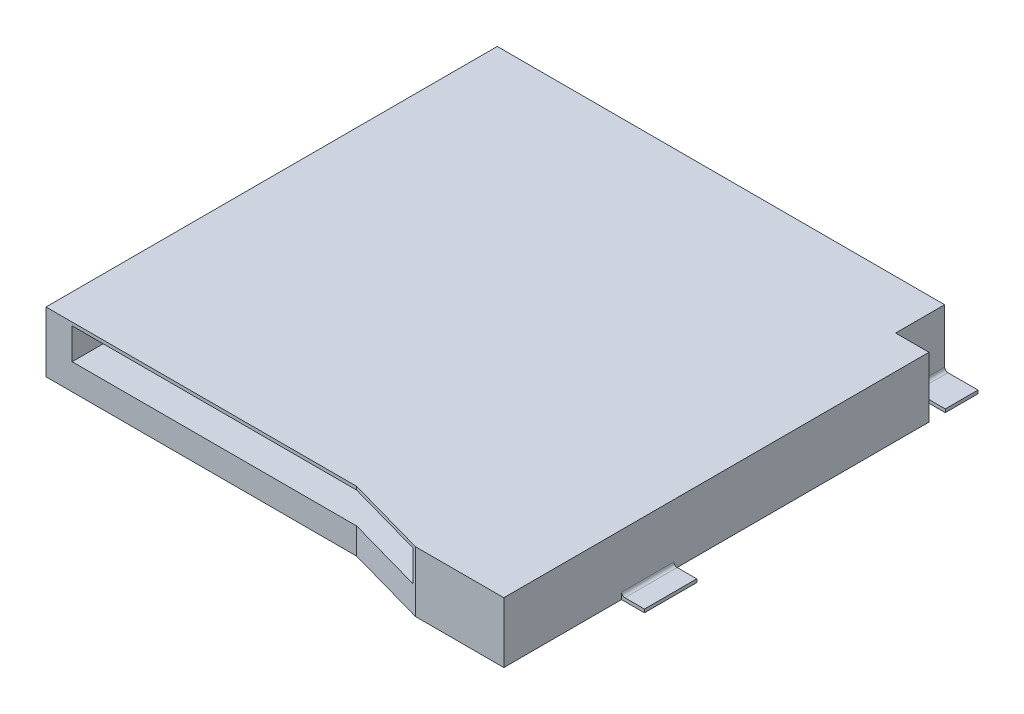
ISO-10303-21;
HEADER;
FILE_DESCRIPTION(('STEP AP214'),'2;1');
FILE_NAME('part.step','',(''),(''),'','','');
FILE_SCHEMA(('AUTOMOTIVE_DESIGN { 1 0 10303 214 1 1 1 1 }'));
ENDSEC;
DATA;
#1=APPLICATION_CONTEXT('core data for automotive mechanical design processes');
#2=APPLICATION_PROTOCOL_DEFINITION('international standard','automotive_design',2000,#1);
#3=PRODUCT_CONTEXT('',#1,'mechanical');
#4=PRODUCT('Part','Part','',(#3));
#5=PRODUCT_RELATED_PRODUCT_CATEGORY('part','',(#4));
#6=PRODUCT_DEFINITION_FORMATION('','',#4);
#7=PRODUCT_DEFINITION_CONTEXT('part definition',#1,'design');
#8=PRODUCT_DEFINITION('design','',#6,#7);
#9=PRODUCT_DEFINITION_SHAPE('','',#8);
#10=(LENGTH_UNIT() NAMED_UNIT(*) SI_UNIT(.MILLI.,.METRE.));
#11=(NAMED_UNIT(*) PLANE_ANGLE_UNIT() SI_UNIT($,.RADIAN.));
#12=(NAMED_UNIT(*) SI_UNIT($,.STERADIAN.) SOLID_ANGLE_UNIT());
#13=UNCERTAINTY_MEASURE_WITH_UNIT(LENGTH_MEASURE(1.E-05),#10,'distance_accuracy_value','');
#14=(GEOMETRIC_REPRESENTATION_CONTEXT(3) GLOBAL_UNCERTAINTY_ASSIGNED_CONTEXT((#13)) GLOBAL_UNIT_ASSIGNED_CONTEXT((#10,
#11,#12)) REPRESENTATION_CONTEXT('',''));
#15=CARTESIAN_POINT('',(0.,0.,0.));
#16=DIRECTION('',(0.,0.,1.));
#17=DIRECTION('',(1.,0.,0.));
#18=AXIS2_PLACEMENT_3D('',#15,#16,#17);
#19=CARTESIAN_POINT('',(0.,0.,0.));
#20=DIRECTION('',(0.,1.,0.));
#21=DIRECTION('',(0.,0.,1.));
#22=AXIS2_PLACEMENT_3D('',#19,#20,#21);
#23=PLANE('',#22);
#24=CARTESIAN_POINT('',(-4.95,0.,2.85));
#25=DIRECTION('',(0.,1.,0.));
#26=DIRECTION('',(0.,0.,1.));
#27=AXIS2_PLACEMENT_3D('',#24,#25,#26);
#28=CIRCLE('',#27,0.4);
#29=CARTESIAN_POINT('',(-4.95,0.,3.25));
#30=VERTEX_POINT('',#29);
#31=EDGE_CURVE('E426',#30,#30,#28,.F.);
#32=ORIENTED_EDGE('',*,*,#31,.F.);
#33=EDGE_LOOP('',(#32));
#34=FACE_BOUND('',#33,.T.);
#35=DIRECTION('',(0.,0.,1.));
#36=VECTOR('',#35,1.);
#37=CARTESIAN_POINT('',(-6.84,0.,-7.65));
#38=LINE('',#37,#36);
#39=CARTESIAN_POINT('',(-6.84,0.,-6.65));
#40=VERTEX_POINT('',#39);
#41=CARTESIAN_POINT('',(-6.84,0.,1.65));
#42=VERTEX_POINT('',#41);
#43=EDGE_CURVE('E368',#40,#42,#38,.T.);
#44=ORIENTED_EDGE('',*,*,#43,.F.);
#45=DIRECTION('',(1.,0.,0.));
#46=VECTOR('',#45,1.);
#47=CARTESIAN_POINT('',(-6.84,0.,-6.65));
#48=LINE('',#47,#46);
#49=CARTESIAN_POINT('',(-7.54,0.,-6.65));
#50=VERTEX_POINT('',#49);
#51=EDGE_CURVE('E311',#50,#40,#48,.T.);
#52=ORIENTED_EDGE('',*,*,#51,.F.);
#53=DIRECTION('',(0.,0.,1.));
#54=VECTOR('',#53,1.);
#55=CARTESIAN_POINT('',(-7.54,0.,-7.65));
#56=LINE('',#55,#54);
#57=CARTESIAN_POINT('',(-7.54,0.,-7.65));
#58=VERTEX_POINT('',#57);
#59=EDGE_CURVE('E302',#58,#50,#56,.T.);
#60=ORIENTED_EDGE('',*,*,#59,.F.);
#61=DIRECTION('',(-1.,0.,0.));
#62=VECTOR('',#61,1.);
#63=CARTESIAN_POINT('',(-6.84,0.,-7.65));
#64=LINE('',#63,#62);
#65=CARTESIAN_POINT('',(7.86,0.,-7.65));
#66=VERTEX_POINT('',#65);
#67=EDGE_CURVE('E447',#66,#58,#64,.T.);
#68=ORIENTED_EDGE('',*,*,#67,.F.);
#69=DIRECTION('',(0.,0.,-1.));
#70=VECTOR('',#69,1.);
#71=CARTESIAN_POINT('',(7.86,0.,-7.65));
#72=LINE('',#71,#70);
#73=CARTESIAN_POINT('',(7.86,0.,-6.65));
#74=VERTEX_POINT('',#73);
#75=EDGE_CURVE('E468',#74,#66,#72,.T.);
#76=ORIENTED_EDGE('',*,*,#75,.F.);
#77=DIRECTION('',(1.,0.,0.));
#78=VECTOR('',#77,1.);
#79=CARTESIAN_POINT('',(6.84,0.,-6.65));
#80=LINE('',#79,#78);
#81=CARTESIAN_POINT('',(6.84,0.,-6.65));
#82=VERTEX_POINT('',#81);
#83=EDGE_CURVE('E465',#82,#74,#80,.T.);
#84=ORIENTED_EDGE('',*,*,#83,.F.);
#85=DIRECTION('',(0.,0.,-1.));
#86=VECTOR('',#85,1.);
#87=CARTESIAN_POINT('',(6.84,0.,-7.65));
#88=LINE('',#87,#86);
#89=CARTESIAN_POINT('',(6.84,0.,-6.15));
#90=VERTEX_POINT('',#89);
#91=EDGE_CURVE('E449',#90,#82,#88,.T.);
#92=ORIENTED_EDGE('',*,*,#91,.F.);
#93=DIRECTION('',(-1.,0.,0.));
#94=VECTOR('',#93,1.);
#95=CARTESIAN_POINT('',(6.84,0.,-6.15));
#96=LINE('',#95,#94);
#97=CARTESIAN_POINT('',(7.86,0.,-6.15));
#98=VERTEX_POINT('',#97);
#99=EDGE_CURVE('E416',#98,#90,#96,.T.);
#100=ORIENTED_EDGE('',*,*,#99,.F.);
#101=DIRECTION('',(0.,0.,-1.));
#102=VECTOR('',#101,1.);
#103=CARTESIAN_POINT('',(7.86,0.,-6.15));
#104=LINE('',#103,#102);
#105=CARTESIAN_POINT('',(7.86,0.,1.65));
#106=VERTEX_POINT('',#105);
#107=EDGE_CURVE('E413',#106,#98,#104,.T.);
#108=ORIENTED_EDGE('',*,*,#107,.F.);
#109=DIRECTION('',(-1.,0.,0.));
#110=VECTOR('',#109,1.);
#111=CARTESIAN_POINT('',(7.86,0.,1.65));
#112=LINE('',#111,#110);
#113=CARTESIAN_POINT('',(8.56,0.,1.65));
#114=VERTEX_POINT('',#113);
#115=EDGE_CURVE('E489',#114,#106,#112,.T.);
#116=ORIENTED_EDGE('',*,*,#115,.F.);
#117=DIRECTION('',(0.,0.,-1.));
#118=VECTOR('',#117,1.);
#119=CARTESIAN_POINT('',(8.56,0.,1.65));
#120=LINE('',#119,#118);
#121=CARTESIAN_POINT('',(8.56,0.,3.25));
#122=VERTEX_POINT('',#121);
#123=EDGE_CURVE('E481',#122,#114,#120,.T.);
#124=ORIENTED_EDGE('',*,*,#123,.F.);
#125=DIRECTION('',(1.,0.,0.));
#126=VECTOR('',#125,1.);
#127=CARTESIAN_POINT('',(7.86,0.,3.25));
#128=LINE('',#127,#126);
#129=CARTESIAN_POINT('',(7.86,0.,3.25));
#130=VERTEX_POINT('',#129);
#131=EDGE_CURVE('E478',#130,#122,#128,.T.);
#132=ORIENTED_EDGE('',*,*,#131,.F.);
#133=CARTESIAN_POINT('',(7.86,0.,6.85));
#134=VERTEX_POINT('',#133);
#135=EDGE_CURVE('E422',#134,#130,#104,.T.);
#136=ORIENTED_EDGE('',*,*,#135,.F.);
#137=DIRECTION('',(1.,0.,0.));
#138=VECTOR('',#137,1.);
#139=CARTESIAN_POINT('',(5.16,0.,6.85));
#140=LINE('',#139,#138);
#141=CARTESIAN_POINT('',(5.16,0.,6.85));
#142=VERTEX_POINT('',#141);
#143=EDGE_CURVE('E411',#142,#134,#140,.T.);
#144=ORIENTED_EDGE('',*,*,#143,.F.);
#145=DIRECTION('',(0.962964019714182,0.,0.269629925519971));
#146=VECTOR('',#145,1.);
#147=CARTESIAN_POINT('',(2.66,0.,6.15));
#148=LINE('',#147,#146);
#149=CARTESIAN_POINT('',(2.66,0.,6.15));
#150=VERTEX_POINT('',#149);
#151=EDGE_CURVE('E409',#150,#142,#148,.T.);
#152=ORIENTED_EDGE('',*,*,#151,.F.);
#153=DIRECTION('',(1.,0.,0.));
#154=VECTOR('',#153,1.);
#155=CARTESIAN_POINT('',(-6.84,0.,6.15));
#156=LINE('',#155,#154);
#157=CARTESIAN_POINT('',(-6.84,0.,6.15));
#158=VERTEX_POINT('',#157);
#159=EDGE_CURVE('E372',#158,#150,#156,.T.);
#160=ORIENTED_EDGE('',*,*,#159,.F.);
#161=CARTESIAN_POINT('',(-6.84,0.,3.25));
#162=VERTEX_POINT('',#161);
#163=EDGE_CURVE('E328',#162,#158,#38,.T.);
#164=ORIENTED_EDGE('',*,*,#163,.F.);
#165=DIRECTION('',(1.,0.,0.));
#166=VECTOR('',#165,1.);
#167=CARTESIAN_POINT('',(-6.84,0.,3.25));
#168=LINE('',#167,#166);
#169=CARTESIAN_POINT('',(-7.54,0.,3.25));
#170=VERTEX_POINT('',#169);
#171=EDGE_CURVE('E281',#170,#162,#168,.T.);
#172=ORIENTED_EDGE('',*,*,#171,.F.);
#173=DIRECTION('',(0.,0.,1.));
#174=VECTOR('',#173,1.);
#175=CARTESIAN_POINT('',(-7.54,0.,1.65));
#176=LINE('',#175,#174);
#177=CARTESIAN_POINT('',(-7.54,0.,1.65));
#178=VERTEX_POINT('',#177);
#179=EDGE_CURVE('E287',#178,#170,#176,.T.);
#180=ORIENTED_EDGE('',*,*,#179,.F.);
#181=DIRECTION('',(-1.,0.,0.));
#182=VECTOR('',#181,1.);
#183=CARTESIAN_POINT('',(-6.84,0.,1.65));
#184=LINE('',#183,#182);
#185=EDGE_CURVE('E277',#42,#178,#184,.T.);
#186=ORIENTED_EDGE('',*,*,#185,.F.);
#187=EDGE_LOOP('',(#44,#52,#60,#68,#76,#84,#92,#100,#108,#116,#124,#132,#136,#144,#152,#160,
#164,#172,#180,#186));
#188=FACE_BOUND('',#187,.T.);
#189=CARTESIAN_POINT('',(3.05,0.,2.85));
#190=DIRECTION('',(0.,1.,0.));
#191=DIRECTION('',(0.,0.,1.));
#192=AXIS2_PLACEMENT_3D('',#189,#190,#191);
#193=CIRCLE('',#192,0.4);
#194=CARTESIAN_POINT('',(3.05,0.,3.25));
#195=VERTEX_POINT('',#194);
#196=EDGE_CURVE('E652',#195,#195,#193,.F.);
#197=ORIENTED_EDGE('',*,*,#196,.F.);
#198=EDGE_LOOP('',(#197));
#199=FACE_BOUND('',#198,.T.);
#200=ADVANCED_FACE('F34',(#34,#188,#199),#23,.F.);
#201=CARTESIAN_POINT('',(-6.84,1.85,-7.65));
#202=DIRECTION('',(1.,0.,0.));
#203=DIRECTION('',(0.,0.,-1.));
#204=AXIS2_PLACEMENT_3D('',#201,#202,#203);
#205=PLANE('',#204);
#206=DIRECTION('',(0.,-1.,0.));
#207=VECTOR('',#206,1.);
#208=CARTESIAN_POINT('',(-6.84,1.85,-7.65));
#209=LINE('',#208,#207);
#210=CARTESIAN_POINT('',(-6.84,1.85,-7.65));
#211=VERTEX_POINT('',#210);
#212=CARTESIAN_POINT('',(-6.84,0.2,-7.65));
#213=VERTEX_POINT('',#212);
#214=EDGE_CURVE('E320',#211,#213,#209,.T.);
#215=ORIENTED_EDGE('',*,*,#214,.T.);
#216=DIRECTION('',(0.,0.,-1.));
#217=VECTOR('',#216,1.);
#218=CARTESIAN_POINT('',(-6.84,0.2,-6.65));
#219=LINE('',#218,#217);
#220=CARTESIAN_POINT('',(-6.84,0.2,-6.65));
#221=VERTEX_POINT('',#220);
#222=EDGE_CURVE('E342',#213,#221,#219,.F.);
#223=ORIENTED_EDGE('',*,*,#222,.T.);
#224=DIRECTION('',(0.,-1.,0.));
#225=VECTOR('',#224,1.);
#226=CARTESIAN_POINT('',(-6.84,0.1,-6.65));
#227=LINE('',#226,#225);
#228=EDGE_CURVE('E309',#221,#40,#227,.T.);
#229=ORIENTED_EDGE('',*,*,#228,.T.);
#230=ORIENTED_EDGE('',*,*,#43,.T.);
#231=DIRECTION('',(0.,-1.,0.));
#232=VECTOR('',#231,1.);
#233=CARTESIAN_POINT('',(-6.84,0.1,1.65));
#234=LINE('',#233,#232);
#235=CARTESIAN_POINT('',(-6.84,0.2,1.65));
#236=VERTEX_POINT('',#235);
#237=EDGE_CURVE('E299',#236,#42,#234,.T.);
#238=ORIENTED_EDGE('',*,*,#237,.F.);
#239=DIRECTION('',(0.,0.,-1.));
#240=VECTOR('',#239,1.);
#241=CARTESIAN_POINT('',(-6.84,0.2,3.25));
#242=LINE('',#241,#240);
#243=CARTESIAN_POINT('',(-6.84,0.2,3.25));
#244=VERTEX_POINT('',#243);
#245=EDGE_CURVE('E339',#236,#244,#242,.F.);
#246=ORIENTED_EDGE('',*,*,#245,.T.);
#247=DIRECTION('',(0.,-1.,0.));
#248=VECTOR('',#247,1.);
#249=CARTESIAN_POINT('',(-6.84,0.1,3.25));
#250=LINE('',#249,#248);
#251=EDGE_CURVE('E285',#244,#162,#250,.T.);
#252=ORIENTED_EDGE('',*,*,#251,.T.);
#253=ORIENTED_EDGE('',*,*,#163,.T.);
#254=DIRECTION('',(0.,-1.,0.));
#255=VECTOR('',#254,1.);
#256=CARTESIAN_POINT('',(-6.84,1.85,6.15));
#257=LINE('',#256,#255);
#258=CARTESIAN_POINT('',(-6.84,1.85,6.15));
#259=VERTEX_POINT('',#258);
#260=EDGE_CURVE('E424',#259,#158,#257,.T.);
#261=ORIENTED_EDGE('',*,*,#260,.F.);
#262=DIRECTION('',(0.,0.,1.));
#263=VECTOR('',#262,1.);
#264=CARTESIAN_POINT('',(-6.84,1.85,-7.65));
#265=LINE('',#264,#263);
#266=EDGE_CURVE('E448',#211,#259,#265,.T.);
#267=ORIENTED_EDGE('',*,*,#266,.F.);
#268=EDGE_LOOP('',(#215,#223,#229,#230,#238,#246,#252,#253,#261,#267));
#269=FACE_BOUND('',#268,.T.);
#270=ADVANCED_FACE('F366',(#269),#205,.F.);
#271=CARTESIAN_POINT('',(6.84,1.85,-7.65));
#272=DIRECTION('',(-1.,0.,0.));
#273=DIRECTION('',(0.,0.,1.));
#274=AXIS2_PLACEMENT_3D('',#271,#272,#273);
#275=PLANE('',#274);
#276=DIRECTION('',(0.,-1.,0.));
#277=VECTOR('',#276,1.);
#278=CARTESIAN_POINT('',(6.84,0.1,-6.65));
#279=LINE('',#278,#277);
#280=CARTESIAN_POINT('',(6.84,0.2,-6.65));
#281=VERTEX_POINT('',#280);
#282=EDGE_CURVE('E474',#281,#82,#279,.T.);
#283=ORIENTED_EDGE('',*,*,#282,.F.);
#284=DIRECTION('',(0.,0.,1.));
#285=VECTOR('',#284,1.);
#286=CARTESIAN_POINT('',(6.84,0.2,-7.65));
#287=LINE('',#286,#285);
#288=CARTESIAN_POINT('',(6.84,0.2,-7.65));
#289=VERTEX_POINT('',#288);
#290=EDGE_CURVE('E626',#281,#289,#287,.F.);
#291=ORIENTED_EDGE('',*,*,#290,.T.);
#292=DIRECTION('',(0.,-1.,0.));
#293=VECTOR('',#292,1.);
#294=CARTESIAN_POINT('',(6.84,1.85,-7.65));
#295=LINE('',#294,#293);
#296=CARTESIAN_POINT('',(6.84,1.85,-7.65));
#297=VERTEX_POINT('',#296);
#298=EDGE_CURVE('E443',#297,#289,#295,.T.);
#299=ORIENTED_EDGE('',*,*,#298,.F.);
#300=DIRECTION('',(0.,0.,-1.));
#301=VECTOR('',#300,1.);
#302=CARTESIAN_POINT('',(6.84,1.85,-7.65));
#303=LINE('',#302,#301);
#304=CARTESIAN_POINT('',(6.84,1.85,-6.15));
#305=VERTEX_POINT('',#304);
#306=EDGE_CURVE('E463',#305,#297,#303,.T.);
#307=ORIENTED_EDGE('',*,*,#306,.F.);
#308=DIRECTION('',(0.,-1.,0.));
#309=VECTOR('',#308,1.);
#310=CARTESIAN_POINT('',(6.84,1.85,-6.15));
#311=LINE('',#310,#309);
#312=EDGE_CURVE('E440',#305,#90,#311,.T.);
#313=ORIENTED_EDGE('',*,*,#312,.T.);
#314=ORIENTED_EDGE('',*,*,#91,.T.);
#315=EDGE_LOOP('',(#283,#291,#299,#307,#313,#314));
#316=FACE_BOUND('',#315,.T.);
#317=ADVANCED_FACE('F461',(#316),#275,.F.);
#318=CARTESIAN_POINT('',(7.86,1.85,-6.15));
#319=DIRECTION('',(-1.,0.,0.));
#320=DIRECTION('',(0.,0.,1.));
#321=AXIS2_PLACEMENT_3D('',#318,#319,#320);
#322=PLANE('',#321);
#323=DIRECTION('',(0.,-1.,0.));
#324=VECTOR('',#323,1.);
#325=CARTESIAN_POINT('',(7.86,0.1,3.25));
#326=LINE('',#325,#324);
#327=CARTESIAN_POINT('',(7.86,0.2,3.25));
#328=VERTEX_POINT('',#327);
#329=EDGE_CURVE('E388',#328,#130,#326,.T.);
#330=ORIENTED_EDGE('',*,*,#329,.F.);
#331=DIRECTION('',(0.,0.,1.));
#332=VECTOR('',#331,1.);
#333=CARTESIAN_POINT('',(7.86,0.2,-6.15));
#334=LINE('',#333,#332);
#335=CARTESIAN_POINT('',(7.86,0.2,1.65));
#336=VERTEX_POINT('',#335);
#337=EDGE_CURVE('E334',#328,#336,#334,.F.);
#338=ORIENTED_EDGE('',*,*,#337,.T.);
#339=DIRECTION('',(0.,-1.,0.));
#340=VECTOR('',#339,1.);
#341=CARTESIAN_POINT('',(7.86,0.1,1.65));
#342=LINE('',#341,#340);
#343=EDGE_CURVE('E494',#336,#106,#342,.T.);
#344=ORIENTED_EDGE('',*,*,#343,.T.);
#345=ORIENTED_EDGE('',*,*,#107,.T.);
#346=DIRECTION('',(0.,-1.,0.));
#347=VECTOR('',#346,1.);
#348=CARTESIAN_POINT('',(7.86,1.85,-6.15));
#349=LINE('',#348,#347);
#350=CARTESIAN_POINT('',(7.86,1.85,-6.15));
#351=VERTEX_POINT('',#350);
#352=EDGE_CURVE('E437',#351,#98,#349,.T.);
#353=ORIENTED_EDGE('',*,*,#352,.F.);
#354=DIRECTION('',(0.,0.,-1.));
#355=VECTOR('',#354,1.);
#356=CARTESIAN_POINT('',(7.86,1.85,-6.15));
#357=LINE('',#356,#355);
#358=CARTESIAN_POINT('',(7.86,1.85,6.85));
#359=VERTEX_POINT('',#358);
#360=EDGE_CURVE('E977',#359,#351,#357,.T.);
#361=ORIENTED_EDGE('',*,*,#360,.F.);
#362=DIRECTION('',(0.,-1.,0.));
#363=VECTOR('',#362,1.);
#364=CARTESIAN_POINT('',(7.86,1.85,6.85));
#365=LINE('',#364,#363);
#366=EDGE_CURVE('E434',#359,#134,#365,.T.);
#367=ORIENTED_EDGE('',*,*,#366,.T.);
#368=ORIENTED_EDGE('',*,*,#135,.T.);
#369=EDGE_LOOP('',(#330,#338,#344,#345,#353,#361,#367,#368));
#370=FACE_BOUND('',#369,.T.);
#371=ADVANCED_FACE('F511',(#370),#322,.F.);
#372=CARTESIAN_POINT('',(-6.84,1.85,6.15));
#373=DIRECTION('',(0.,0.,-1.));
#374=DIRECTION('',(-1.,0.,0.));
#375=AXIS2_PLACEMENT_3D('',#372,#373,#374);
#376=PLANE('',#375);
#377=DIRECTION('',(0.,1.,0.));
#378=VECTOR('',#377,1.);
#379=CARTESIAN_POINT('',(-6.04,1.85,6.15));
#380=LINE('',#379,#378);
#381=CARTESIAN_POINT('',(-6.04,0.8,6.15));
#382=VERTEX_POINT('',#381);
#383=CARTESIAN_POINT('',(-6.04,1.75,6.15));
#384=VERTEX_POINT('',#383);
#385=EDGE_CURVE('E245',#382,#384,#380,.T.);
#386=ORIENTED_EDGE('',*,*,#385,.T.);
#387=DIRECTION('',(1.,0.,0.));
#388=VECTOR('',#387,1.);
#389=CARTESIAN_POINT('',(-6.84,1.75,6.15));
#390=LINE('',#389,#388);
#391=CARTESIAN_POINT('',(2.66,1.75,6.15));
#392=VERTEX_POINT('',#391);
#393=EDGE_CURVE('E274',#384,#392,#390,.T.);
#394=ORIENTED_EDGE('',*,*,#393,.T.);
#395=DIRECTION('',(0.,-1.,0.));
#396=VECTOR('',#395,1.);
#397=CARTESIAN_POINT('',(2.66,1.85,6.15));
#398=LINE('',#397,#396);
#399=CARTESIAN_POINT('',(2.66,1.85,6.15));
#400=VERTEX_POINT('',#399);
#401=EDGE_CURVE('E427',#400,#392,#398,.T.);
#402=ORIENTED_EDGE('',*,*,#401,.F.);
#403=DIRECTION('',(1.,0.,0.));
#404=VECTOR('',#403,1.);
#405=CARTESIAN_POINT('',(-6.84,1.85,6.15));
#406=LINE('',#405,#404);
#407=EDGE_CURVE('E966',#259,#400,#406,.T.);
#408=ORIENTED_EDGE('',*,*,#407,.F.);
#409=ORIENTED_EDGE('',*,*,#260,.T.);
#410=ORIENTED_EDGE('',*,*,#159,.T.);
#411=CARTESIAN_POINT('',(2.66,0.8,6.15));
#412=VERTEX_POINT('',#411);
#413=EDGE_CURVE('E430',#412,#150,#398,.T.);
#414=ORIENTED_EDGE('',*,*,#413,.F.);
#415=DIRECTION('',(-1.,0.,0.));
#416=VECTOR('',#415,1.);
#417=CARTESIAN_POINT('',(-6.84,0.8,6.15));
#418=LINE('',#417,#416);
#419=EDGE_CURVE('E268',#412,#382,#418,.T.);
#420=ORIENTED_EDGE('',*,*,#419,.T.);
#421=EDGE_LOOP('',(#386,#394,#402,#408,#409,#410,#414,#420));
#422=FACE_BOUND('',#421,.T.);
#423=ADVANCED_FACE('F559',(#422),#376,.F.);
#424=CARTESIAN_POINT('',(2.66,1.85,6.15));
#425=DIRECTION('',(0.269629925519971,0.,-0.962964019714182));
#426=DIRECTION('',(-0.962964019714182,0.,-0.269629925519971));
#427=AXIS2_PLACEMENT_3D('',#424,#425,#426);
#428=PLANE('',#427);
#429=ORIENTED_EDGE('',*,*,#401,.T.);
#430=DIRECTION('',(0.962964019714182,0.,0.269629925519971));
#431=VECTOR('',#430,1.);
#432=CARTESIAN_POINT('',(2.66,1.75,6.15));
#433=LINE('',#432,#431);
#434=CARTESIAN_POINT('',(5.06,1.75,6.822));
#435=VERTEX_POINT('',#434);
#436=EDGE_CURVE('E643',#392,#435,#433,.T.);
#437=ORIENTED_EDGE('',*,*,#436,.T.);
#438=DIRECTION('',(0.,-1.,0.));
#439=VECTOR('',#438,1.);
#440=CARTESIAN_POINT('',(5.06,1.85,6.822));
#441=LINE('',#440,#439);
#442=CARTESIAN_POINT('',(5.06,0.8,6.822));
#443=VERTEX_POINT('',#442);
#444=EDGE_CURVE('E646',#435,#443,#441,.T.);
#445=ORIENTED_EDGE('',*,*,#444,.T.);
#446=DIRECTION('',(-0.962964019714182,0.,-0.269629925519971));
#447=VECTOR('',#446,1.);
#448=CARTESIAN_POINT('',(2.66,0.8,6.15));
#449=LINE('',#448,#447);
#450=EDGE_CURVE('E649',#443,#412,#449,.T.);
#451=ORIENTED_EDGE('',*,*,#450,.T.);
#452=ORIENTED_EDGE('',*,*,#413,.T.);
#453=ORIENTED_EDGE('',*,*,#151,.T.);
#454=DIRECTION('',(0.,-1.,0.));
#455=VECTOR('',#454,1.);
#456=CARTESIAN_POINT('',(5.16,1.85,6.85));
#457=LINE('',#456,#455);
#458=CARTESIAN_POINT('',(5.16,1.85,6.85));
#459=VERTEX_POINT('',#458);
#460=EDGE_CURVE('E431',#459,#142,#457,.T.);
#461=ORIENTED_EDGE('',*,*,#460,.F.);
#462=DIRECTION('',(0.962964019714182,0.,0.269629925519971));
#463=VECTOR('',#462,1.);
#464=CARTESIAN_POINT('',(2.66,1.85,6.15));
#465=LINE('',#464,#463);
#466=EDGE_CURVE('E965',#400,#459,#465,.T.);
#467=ORIENTED_EDGE('',*,*,#466,.F.);
#468=EDGE_LOOP('',(#429,#437,#445,#451,#452,#453,#461,#467));
#469=FACE_BOUND('',#468,.T.);
#470=ADVANCED_FACE('F562',(#469),#428,.F.);
#471=CARTESIAN_POINT('',(5.16,1.85,6.85));
#472=DIRECTION('',(0.,0.,-1.));
#473=DIRECTION('',(-1.,0.,0.));
#474=AXIS2_PLACEMENT_3D('',#471,#472,#473);
#475=PLANE('',#474);
#476=ORIENTED_EDGE('',*,*,#143,.T.);
#477=ORIENTED_EDGE('',*,*,#366,.F.);
#478=DIRECTION('',(1.,0.,0.));
#479=VECTOR('',#478,1.);
#480=CARTESIAN_POINT('',(5.16,1.85,6.85));
#481=LINE('',#480,#479);
#482=EDGE_CURVE('E975',#459,#359,#481,.T.);
#483=ORIENTED_EDGE('',*,*,#482,.F.);
#484=ORIENTED_EDGE('',*,*,#460,.T.);
#485=EDGE_LOOP('',(#476,#477,#483,#484));
#486=FACE_BOUND('',#485,.T.);
#487=ADVANCED_FACE('F556',(#486),#475,.F.);
#488=CARTESIAN_POINT('',(6.84,1.85,-6.15));
#489=DIRECTION('',(0.,0.,1.));
#490=DIRECTION('',(1.,0.,0.));
#491=AXIS2_PLACEMENT_3D('',#488,#489,#490);
#492=PLANE('',#491);
#493=ORIENTED_EDGE('',*,*,#99,.T.);
#494=ORIENTED_EDGE('',*,*,#312,.F.);
#495=DIRECTION('',(-1.,0.,0.));
#496=VECTOR('',#495,1.);
#497=CARTESIAN_POINT('',(6.84,1.85,-6.15));
#498=LINE('',#497,#496);
#499=EDGE_CURVE('E979',#351,#305,#498,.T.);
#500=ORIENTED_EDGE('',*,*,#499,.F.);
#501=ORIENTED_EDGE('',*,*,#352,.T.);
#502=EDGE_LOOP('',(#493,#494,#500,#501));
#503=FACE_BOUND('',#502,.T.);
#504=ADVANCED_FACE('F456',(#503),#492,.F.);
#505=CARTESIAN_POINT('',(-6.84,1.85,-7.65));
#506=DIRECTION('',(0.,0.,1.));
#507=DIRECTION('',(1.,0.,0.));
#508=AXIS2_PLACEMENT_3D('',#505,#506,#507);
#509=PLANE('',#508);
#510=ORIENTED_EDGE('',*,*,#67,.T.);
#511=DIRECTION('',(0.,-1.,0.));
#512=VECTOR('',#511,1.);
#513=CARTESIAN_POINT('',(-7.54,0.1,-7.65));
#514=LINE('',#513,#512);
#515=CARTESIAN_POINT('',(-7.54,0.1,-7.65));
#516=VERTEX_POINT('',#515);
#517=EDGE_CURVE('E472',#516,#58,#514,.T.);
#518=ORIENTED_EDGE('',*,*,#517,.F.);
#519=DIRECTION('',(-1.,0.,0.));
#520=VECTOR('',#519,1.);
#521=CARTESIAN_POINT('',(-6.84,0.1,-7.65));
#522=LINE('',#521,#520);
#523=CARTESIAN_POINT('',(-6.94,0.1,-7.65));
#524=VERTEX_POINT('',#523);
#525=EDGE_CURVE('E306',#524,#516,#522,.T.);
#526=ORIENTED_EDGE('',*,*,#525,.F.);
#527=CARTESIAN_POINT('',(-6.94,0.2,-7.65));
#528=DIRECTION('',(0.,0.,1.));
#529=DIRECTION('',(1.,0.,0.));
#530=AXIS2_PLACEMENT_3D('',#527,#528,#529);
#531=CIRCLE('',#530,0.1);
#532=EDGE_CURVE('E357',#524,#213,#531,.T.);
#533=ORIENTED_EDGE('',*,*,#532,.T.);
#534=ORIENTED_EDGE('',*,*,#214,.F.);
#535=DIRECTION('',(-1.,0.,0.));
#536=VECTOR('',#535,1.);
#537=CARTESIAN_POINT('',(-6.84,1.85,-7.65));
#538=LINE('',#537,#536);
#539=EDGE_CURVE('E405',#297,#211,#538,.T.);
#540=ORIENTED_EDGE('',*,*,#539,.F.);
#541=ORIENTED_EDGE('',*,*,#298,.T.);
#542=CARTESIAN_POINT('',(6.94,0.2,-7.65));
#543=DIRECTION('',(0.,0.,1.));
#544=DIRECTION('',(1.,0.,0.));
#545=AXIS2_PLACEMENT_3D('',#542,#543,#544);
#546=CIRCLE('',#545,0.1);
#547=CARTESIAN_POINT('',(6.94,0.1,-7.65));
#548=VERTEX_POINT('',#547);
#549=EDGE_CURVE('E350',#289,#548,#546,.T.);
#550=ORIENTED_EDGE('',*,*,#549,.T.);
#551=DIRECTION('',(-1.,0.,0.));
#552=VECTOR('',#551,1.);
#553=CARTESIAN_POINT('',(6.84,0.1,-7.65));
#554=LINE('',#553,#552);
#555=CARTESIAN_POINT('',(7.86,0.1,-7.65));
#556=VERTEX_POINT('',#555);
#557=EDGE_CURVE('E611',#556,#548,#554,.T.);
#558=ORIENTED_EDGE('',*,*,#557,.F.);
#559=DIRECTION('',(0.,-1.,0.));
#560=VECTOR('',#559,1.);
#561=CARTESIAN_POINT('',(7.86,0.1,-7.65));
#562=LINE('',#561,#560);
#563=EDGE_CURVE('E482',#556,#66,#562,.T.);
#564=ORIENTED_EDGE('',*,*,#563,.T.);
#565=EDGE_LOOP('',(#510,#518,#526,#533,#534,#540,#541,#550,#558,#564));
#566=FACE_BOUND('',#565,.T.);
#567=ADVANCED_FACE('F537',(#566),#509,.F.);
#568=CARTESIAN_POINT('',(0.,1.85,0.));
#569=DIRECTION('',(0.,1.,0.));
#570=DIRECTION('',(0.,0.,1.));
#571=AXIS2_PLACEMENT_3D('',#568,#569,#570);
#572=PLANE('',#571);
#573=ORIENTED_EDGE('',*,*,#266,.T.);
#574=ORIENTED_EDGE('',*,*,#407,.T.);
#575=ORIENTED_EDGE('',*,*,#466,.T.);
#576=ORIENTED_EDGE('',*,*,#482,.T.);
#577=ORIENTED_EDGE('',*,*,#360,.T.);
#578=ORIENTED_EDGE('',*,*,#499,.T.);
#579=ORIENTED_EDGE('',*,*,#306,.T.);
#580=ORIENTED_EDGE('',*,*,#539,.T.);
#581=EDGE_LOOP('',(#573,#574,#575,#576,#577,#578,#579,#580));
#582=FACE_BOUND('',#581,.T.);
#583=ADVANCED_FACE('F530',(#582),#572,.T.);
#584=CARTESIAN_POINT('',(7.86,0.1,3.25));
#585=DIRECTION('',(0.,0.,-1.));
#586=DIRECTION('',(-1.,0.,0.));
#587=AXIS2_PLACEMENT_3D('',#584,#585,#586);
#588=PLANE('',#587);
#589=ORIENTED_EDGE('',*,*,#131,.T.);
#590=DIRECTION('',(0.,-1.,0.));
#591=VECTOR('',#590,1.);
#592=CARTESIAN_POINT('',(8.56,0.1,3.25));
#593=LINE('',#592,#591);
#594=CARTESIAN_POINT('',(8.56,0.1,3.25));
#595=VERTEX_POINT('',#594);
#596=EDGE_CURVE('E390',#595,#122,#593,.T.);
#597=ORIENTED_EDGE('',*,*,#596,.F.);
#598=DIRECTION('',(1.,0.,0.));
#599=VECTOR('',#598,1.);
#600=CARTESIAN_POINT('',(7.86,0.1,3.25));
#601=LINE('',#600,#599);
#602=CARTESIAN_POINT('',(7.96,0.1,3.25));
#603=VERTEX_POINT('',#602);
#604=EDGE_CURVE('E486',#603,#595,#601,.T.);
#605=ORIENTED_EDGE('',*,*,#604,.F.);
#606=CARTESIAN_POINT('',(7.96,0.2,3.25));
#607=DIRECTION('',(0.,0.,-1.));
#608=DIRECTION('',(-1.,0.,0.));
#609=AXIS2_PLACEMENT_3D('',#606,#607,#608);
#610=CIRCLE('',#609,0.1);
#611=EDGE_CURVE('E352',#603,#328,#610,.T.);
#612=ORIENTED_EDGE('',*,*,#611,.T.);
#613=ORIENTED_EDGE('',*,*,#329,.T.);
#614=EDGE_LOOP('',(#589,#597,#605,#612,#613));
#615=FACE_BOUND('',#614,.T.);
#616=ADVANCED_FACE('F528',(#615),#588,.F.);
#617=CARTESIAN_POINT('',(8.56,0.1,1.65));
#618=DIRECTION('',(-1.,0.,0.));
#619=DIRECTION('',(0.,0.,1.));
#620=AXIS2_PLACEMENT_3D('',#617,#618,#619);
#621=PLANE('',#620);
#622=ORIENTED_EDGE('',*,*,#123,.T.);
#623=DIRECTION('',(0.,-1.,0.));
#624=VECTOR('',#623,1.);
#625=CARTESIAN_POINT('',(8.56,0.1,1.65));
#626=LINE('',#625,#624);
#627=CARTESIAN_POINT('',(8.56,0.1,1.65));
#628=VERTEX_POINT('',#627);
#629=EDGE_CURVE('E395',#628,#114,#626,.T.);
#630=ORIENTED_EDGE('',*,*,#629,.F.);
#631=DIRECTION('',(0.,0.,-1.));
#632=VECTOR('',#631,1.);
#633=CARTESIAN_POINT('',(8.56,0.1,1.65));
#634=LINE('',#633,#632);
#635=EDGE_CURVE('E488',#595,#628,#634,.T.);
#636=ORIENTED_EDGE('',*,*,#635,.F.);
#637=ORIENTED_EDGE('',*,*,#596,.T.);
#638=EDGE_LOOP('',(#622,#630,#636,#637));
#639=FACE_BOUND('',#638,.T.);
#640=ADVANCED_FACE('F525',(#639),#621,.F.);
#641=CARTESIAN_POINT('',(7.86,0.1,1.65));
#642=DIRECTION('',(0.,0.,1.));
#643=DIRECTION('',(1.,0.,0.));
#644=AXIS2_PLACEMENT_3D('',#641,#642,#643);
#645=PLANE('',#644);
#646=ORIENTED_EDGE('',*,*,#115,.T.);
#647=ORIENTED_EDGE('',*,*,#343,.F.);
#648=CARTESIAN_POINT('',(7.96,0.2,1.65));
#649=DIRECTION('',(0.,0.,1.));
#650=DIRECTION('',(1.,0.,0.));
#651=AXIS2_PLACEMENT_3D('',#648,#649,#650);
#652=CIRCLE('',#651,0.1);
#653=CARTESIAN_POINT('',(7.96,0.1,1.65));
#654=VERTEX_POINT('',#653);
#655=EDGE_CURVE('E355',#336,#654,#652,.T.);
#656=ORIENTED_EDGE('',*,*,#655,.T.);
#657=DIRECTION('',(-1.,0.,0.));
#658=VECTOR('',#657,1.);
#659=CARTESIAN_POINT('',(7.86,0.1,1.65));
#660=LINE('',#659,#658);
#661=EDGE_CURVE('E491',#628,#654,#660,.T.);
#662=ORIENTED_EDGE('',*,*,#661,.F.);
#663=ORIENTED_EDGE('',*,*,#629,.T.);
#664=EDGE_LOOP('',(#646,#647,#656,#662,#663));
#665=FACE_BOUND('',#664,.T.);
#666=ADVANCED_FACE('F505',(#665),#645,.F.);
#667=CARTESIAN_POINT('',(0.,0.1,0.));
#668=DIRECTION('',(0.,1.,0.));
#669=DIRECTION('',(0.,0.,1.));
#670=AXIS2_PLACEMENT_3D('',#667,#668,#669);
#671=PLANE('',#670);
#672=ORIENTED_EDGE('',*,*,#661,.T.);
#673=DIRECTION('',(0.,0.,1.));
#674=VECTOR('',#673,1.);
#675=CARTESIAN_POINT('',(7.96,0.1,0.));
#676=LINE('',#675,#674);
#677=EDGE_CURVE('E515',#654,#603,#676,.T.);
#678=ORIENTED_EDGE('',*,*,#677,.T.);
#679=ORIENTED_EDGE('',*,*,#604,.T.);
#680=ORIENTED_EDGE('',*,*,#635,.T.);
#681=EDGE_LOOP('',(#672,#678,#679,#680));
#682=FACE_BOUND('',#681,.T.);
#683=ADVANCED_FACE('F520',(#682),#671,.T.);
#684=CARTESIAN_POINT('',(6.84,0.1,-6.65));
#685=DIRECTION('',(0.,0.,-1.));
#686=DIRECTION('',(-1.,0.,0.));
#687=AXIS2_PLACEMENT_3D('',#684,#685,#686);
#688=PLANE('',#687);
#689=ORIENTED_EDGE('',*,*,#83,.T.);
#690=DIRECTION('',(0.,-1.,0.));
#691=VECTOR('',#690,1.);
#692=CARTESIAN_POINT('',(7.86,0.1,-6.65));
#693=LINE('',#692,#691);
#694=CARTESIAN_POINT('',(7.86,0.1,-6.65));
#695=VERTEX_POINT('',#694);
#696=EDGE_CURVE('E479',#695,#74,#693,.T.);
#697=ORIENTED_EDGE('',*,*,#696,.F.);
#698=DIRECTION('',(1.,0.,0.));
#699=VECTOR('',#698,1.);
#700=CARTESIAN_POINT('',(6.84,0.1,-6.65));
#701=LINE('',#700,#699);
#702=CARTESIAN_POINT('',(6.94,0.1,-6.65));
#703=VERTEX_POINT('',#702);
#704=EDGE_CURVE('E607',#703,#695,#701,.T.);
#705=ORIENTED_EDGE('',*,*,#704,.F.);
#706=CARTESIAN_POINT('',(6.94,0.2,-6.65));
#707=DIRECTION('',(0.,0.,-1.));
#708=DIRECTION('',(-1.,0.,0.));
#709=AXIS2_PLACEMENT_3D('',#706,#707,#708);
#710=CIRCLE('',#709,0.1);
#711=EDGE_CURVE('E347',#703,#281,#710,.T.);
#712=ORIENTED_EDGE('',*,*,#711,.T.);
#713=ORIENTED_EDGE('',*,*,#282,.T.);
#714=EDGE_LOOP('',(#689,#697,#705,#712,#713));
#715=FACE_BOUND('',#714,.T.);
#716=ADVANCED_FACE('F475',(#715),#688,.F.);
#717=CARTESIAN_POINT('',(7.86,0.1,-7.65));
#718=DIRECTION('',(-1.,0.,0.));
#719=DIRECTION('',(0.,0.,1.));
#720=AXIS2_PLACEMENT_3D('',#717,#718,#719);
#721=PLANE('',#720);
#722=ORIENTED_EDGE('',*,*,#75,.T.);
#723=ORIENTED_EDGE('',*,*,#563,.F.);
#724=DIRECTION('',(0.,0.,-1.));
#725=VECTOR('',#724,1.);
#726=CARTESIAN_POINT('',(7.86,0.1,-7.65));
#727=LINE('',#726,#725);
#728=EDGE_CURVE('E609',#695,#556,#727,.T.);
#729=ORIENTED_EDGE('',*,*,#728,.F.);
#730=ORIENTED_EDGE('',*,*,#696,.T.);
#731=EDGE_LOOP('',(#722,#723,#729,#730));
#732=FACE_BOUND('',#731,.T.);
#733=ADVANCED_FACE('F619',(#732),#721,.F.);
#734=CARTESIAN_POINT('',(0.,0.1,0.));
#735=DIRECTION('',(0.,1.,0.));
#736=DIRECTION('',(0.,0.,1.));
#737=AXIS2_PLACEMENT_3D('',#734,#735,#736);
#738=PLANE('',#737);
#739=ORIENTED_EDGE('',*,*,#557,.T.);
#740=DIRECTION('',(0.,0.,1.));
#741=VECTOR('',#740,1.);
#742=CARTESIAN_POINT('',(6.94,0.1,0.));
#743=LINE('',#742,#741);
#744=EDGE_CURVE('E624',#548,#703,#743,.T.);
#745=ORIENTED_EDGE('',*,*,#744,.T.);
#746=ORIENTED_EDGE('',*,*,#704,.T.);
#747=ORIENTED_EDGE('',*,*,#728,.T.);
#748=EDGE_LOOP('',(#739,#745,#746,#747));
#749=FACE_BOUND('',#748,.T.);
#750=ADVANCED_FACE('F622',(#749),#738,.T.);
#751=CARTESIAN_POINT('',(-7.54,0.1,-7.65));
#752=DIRECTION('',(1.,0.,0.));
#753=DIRECTION('',(0.,0.,-1.));
#754=AXIS2_PLACEMENT_3D('',#751,#752,#753);
#755=PLANE('',#754);
#756=ORIENTED_EDGE('',*,*,#59,.T.);
#757=DIRECTION('',(0.,-1.,0.));
#758=VECTOR('',#757,1.);
#759=CARTESIAN_POINT('',(-7.54,0.1,-6.65));
#760=LINE('',#759,#758);
#761=CARTESIAN_POINT('',(-7.54,0.1,-6.65));
#762=VERTEX_POINT('',#761);
#763=EDGE_CURVE('E314',#762,#50,#760,.T.);
#764=ORIENTED_EDGE('',*,*,#763,.F.);
#765=DIRECTION('',(0.,0.,1.));
#766=VECTOR('',#765,1.);
#767=CARTESIAN_POINT('',(-7.54,0.1,-7.65));
#768=LINE('',#767,#766);
#769=EDGE_CURVE('E303',#516,#762,#768,.T.);
#770=ORIENTED_EDGE('',*,*,#769,.F.);
#771=ORIENTED_EDGE('',*,*,#517,.T.);
#772=EDGE_LOOP('',(#756,#764,#770,#771));
#773=FACE_BOUND('',#772,.T.);
#774=ADVANCED_FACE('F604',(#773),#755,.F.);
#775=CARTESIAN_POINT('',(-6.84,0.1,-6.65));
#776=DIRECTION('',(0.,0.,-1.));
#777=DIRECTION('',(-1.,0.,0.));
#778=AXIS2_PLACEMENT_3D('',#775,#776,#777);
#779=PLANE('',#778);
#780=ORIENTED_EDGE('',*,*,#51,.T.);
#781=ORIENTED_EDGE('',*,*,#228,.F.);
#782=CARTESIAN_POINT('',(-6.94,0.2,-6.65));
#783=DIRECTION('',(0.,0.,-1.));
#784=DIRECTION('',(-1.,0.,0.));
#785=AXIS2_PLACEMENT_3D('',#782,#783,#784);
#786=CIRCLE('',#785,0.1);
#787=CARTESIAN_POINT('',(-6.94,0.1,-6.65));
#788=VERTEX_POINT('',#787);
#789=EDGE_CURVE('E359',#221,#788,#786,.T.);
#790=ORIENTED_EDGE('',*,*,#789,.T.);
#791=DIRECTION('',(1.,0.,0.));
#792=VECTOR('',#791,1.);
#793=CARTESIAN_POINT('',(-6.84,0.1,-6.65));
#794=LINE('',#793,#792);
#795=EDGE_CURVE('E305',#762,#788,#794,.T.);
#796=ORIENTED_EDGE('',*,*,#795,.F.);
#797=ORIENTED_EDGE('',*,*,#763,.T.);
#798=EDGE_LOOP('',(#780,#781,#790,#796,#797));
#799=FACE_BOUND('',#798,.T.);
#800=ADVANCED_FACE('F594',(#799),#779,.F.);
#801=CARTESIAN_POINT('',(0.,0.1,0.));
#802=DIRECTION('',(0.,-1.,0.));
#803=DIRECTION('',(0.,0.,-1.));
#804=AXIS2_PLACEMENT_3D('',#801,#802,#803);
#805=PLANE('',#804);
#806=ORIENTED_EDGE('',*,*,#795,.T.);
#807=DIRECTION('',(0.,0.,-1.));
#808=VECTOR('',#807,1.);
#809=CARTESIAN_POINT('',(-6.94,0.1,-7.65));
#810=LINE('',#809,#808);
#811=EDGE_CURVE('E336',#788,#524,#810,.T.);
#812=ORIENTED_EDGE('',*,*,#811,.T.);
#813=ORIENTED_EDGE('',*,*,#525,.T.);
#814=ORIENTED_EDGE('',*,*,#769,.T.);
#815=EDGE_LOOP('',(#806,#812,#813,#814));
#816=FACE_BOUND('',#815,.T.);
#817=ADVANCED_FACE('F597',(#816),#805,.F.);
#818=CARTESIAN_POINT('',(-6.84,0.1,1.65));
#819=DIRECTION('',(0.,0.,1.));
#820=DIRECTION('',(1.,0.,0.));
#821=AXIS2_PLACEMENT_3D('',#818,#819,#820);
#822=PLANE('',#821);
#823=ORIENTED_EDGE('',*,*,#185,.T.);
#824=DIRECTION('',(0.,-1.,0.));
#825=VECTOR('',#824,1.);
#826=CARTESIAN_POINT('',(-7.54,0.1,1.65));
#827=LINE('',#826,#825);
#828=CARTESIAN_POINT('',(-7.54,0.1,1.65));
#829=VERTEX_POINT('',#828);
#830=EDGE_CURVE('E296',#829,#178,#827,.T.);
#831=ORIENTED_EDGE('',*,*,#830,.F.);
#832=DIRECTION('',(-1.,0.,0.));
#833=VECTOR('',#832,1.);
#834=CARTESIAN_POINT('',(-6.84,0.1,1.65));
#835=LINE('',#834,#833);
#836=CARTESIAN_POINT('',(-6.94,0.1,1.65));
#837=VERTEX_POINT('',#836);
#838=EDGE_CURVE('E278',#837,#829,#835,.T.);
#839=ORIENTED_EDGE('',*,*,#838,.F.);
#840=CARTESIAN_POINT('',(-6.94,0.2,1.65));
#841=DIRECTION('',(0.,0.,1.));
#842=DIRECTION('',(1.,0.,0.));
#843=AXIS2_PLACEMENT_3D('',#840,#841,#842);
#844=CIRCLE('',#843,0.1);
#845=EDGE_CURVE('E42',#837,#236,#844,.T.);
#846=ORIENTED_EDGE('',*,*,#845,.T.);
#847=ORIENTED_EDGE('',*,*,#237,.T.);
#848=EDGE_LOOP('',(#823,#831,#839,#846,#847));
#849=FACE_BOUND('',#848,.T.);
#850=ADVANCED_FACE('F362',(#849),#822,.F.);
#851=CARTESIAN_POINT('',(-7.54,0.1,1.65));
#852=DIRECTION('',(1.,0.,0.));
#853=DIRECTION('',(0.,0.,-1.));
#854=AXIS2_PLACEMENT_3D('',#851,#852,#853);
#855=PLANE('',#854);
#856=ORIENTED_EDGE('',*,*,#179,.T.);
#857=DIRECTION('',(0.,-1.,0.));
#858=VECTOR('',#857,1.);
#859=CARTESIAN_POINT('',(-7.54,0.1,3.25));
#860=LINE('',#859,#858);
#861=CARTESIAN_POINT('',(-7.54,0.1,3.25));
#862=VERTEX_POINT('',#861);
#863=EDGE_CURVE('E293',#862,#170,#860,.T.);
#864=ORIENTED_EDGE('',*,*,#863,.F.);
#865=DIRECTION('',(0.,0.,1.));
#866=VECTOR('',#865,1.);
#867=CARTESIAN_POINT('',(-7.54,0.1,1.65));
#868=LINE('',#867,#866);
#869=EDGE_CURVE('E280',#829,#862,#868,.T.);
#870=ORIENTED_EDGE('',*,*,#869,.F.);
#871=ORIENTED_EDGE('',*,*,#830,.T.);
#872=EDGE_LOOP('',(#856,#864,#870,#871));
#873=FACE_BOUND('',#872,.T.);
#874=ADVANCED_FACE('F378',(#873),#855,.F.);
#875=CARTESIAN_POINT('',(-6.84,0.1,3.25));
#876=DIRECTION('',(0.,0.,-1.));
#877=DIRECTION('',(-1.,0.,0.));
#878=AXIS2_PLACEMENT_3D('',#875,#876,#877);
#879=PLANE('',#878);
#880=ORIENTED_EDGE('',*,*,#171,.T.);
#881=ORIENTED_EDGE('',*,*,#251,.F.);
#882=CARTESIAN_POINT('',(-6.94,0.2,3.25));
#883=DIRECTION('',(0.,0.,-1.));
#884=DIRECTION('',(-1.,0.,0.));
#885=AXIS2_PLACEMENT_3D('',#882,#883,#884);
#886=CIRCLE('',#885,0.1);
#887=CARTESIAN_POINT('',(-6.94,0.1,3.25));
#888=VERTEX_POINT('',#887);
#889=EDGE_CURVE('E11',#244,#888,#886,.T.);
#890=ORIENTED_EDGE('',*,*,#889,.T.);
#891=DIRECTION('',(1.,0.,0.));
#892=VECTOR('',#891,1.);
#893=CARTESIAN_POINT('',(-6.84,0.1,3.25));
#894=LINE('',#893,#892);
#895=EDGE_CURVE('E283',#862,#888,#894,.T.);
#896=ORIENTED_EDGE('',*,*,#895,.F.);
#897=ORIENTED_EDGE('',*,*,#863,.T.);
#898=EDGE_LOOP('',(#880,#881,#890,#896,#897));
#899=FACE_BOUND('',#898,.T.);
#900=ADVANCED_FACE('F382',(#899),#879,.F.);
#901=CARTESIAN_POINT('',(0.,0.1,0.));
#902=DIRECTION('',(0.,-1.,0.));
#903=DIRECTION('',(0.,0.,-1.));
#904=AXIS2_PLACEMENT_3D('',#901,#902,#903);
#905=PLANE('',#904);
#906=ORIENTED_EDGE('',*,*,#895,.T.);
#907=DIRECTION('',(0.,0.,-1.));
#908=VECTOR('',#907,1.);
#909=CARTESIAN_POINT('',(-6.94,0.1,1.65));
#910=LINE('',#909,#908);
#911=EDGE_CURVE('E345',#888,#837,#910,.T.);
#912=ORIENTED_EDGE('',*,*,#911,.T.);
#913=ORIENTED_EDGE('',*,*,#838,.T.);
#914=ORIENTED_EDGE('',*,*,#869,.T.);
#915=EDGE_LOOP('',(#906,#912,#913,#914));
#916=FACE_BOUND('',#915,.T.);
#917=ADVANCED_FACE('F381',(#916),#905,.F.);
#918=CARTESIAN_POINT('',(-4.95,-0.6,2.85));
#919=DIRECTION('',(0.,1.,0.));
#920=DIRECTION('',(0.,0.,1.));
#921=AXIS2_PLACEMENT_3D('',#918,#919,#920);
#922=CYLINDRICAL_SURFACE('',#921,0.4);
#923=CARTESIAN_POINT('',(-4.95,-0.5,2.85));
#924=DIRECTION('',(0.,-1.,0.));
#925=DIRECTION('',(0.,0.,-1.));
#926=AXIS2_PLACEMENT_3D('',#923,#924,#925);
#927=CIRCLE('',#926,0.4);
#928=CARTESIAN_POINT('',(-4.95,-0.5,2.45));
#929=VERTEX_POINT('',#928);
#930=EDGE_CURVE('E627',#929,#929,#927,.F.);
#931=ORIENTED_EDGE('',*,*,#930,.T.);
#932=EDGE_LOOP('',(#931));
#933=FACE_BOUND('',#932,.T.);
#934=ORIENTED_EDGE('',*,*,#31,.T.);
#935=EDGE_LOOP('',(#934));
#936=FACE_BOUND('',#935,.T.);
#937=ADVANCED_FACE('F656',(#933,#936),#922,.T.);
#938=CARTESIAN_POINT('',(-4.95,-0.6,2.85));
#939=DIRECTION('',(0.,-1.,0.));
#940=DIRECTION('',(0.,0.,-1.));
#941=AXIS2_PLACEMENT_3D('',#938,#939,#940);
#942=PLANE('',#941);
#943=CARTESIAN_POINT('',(-4.95,-0.6,2.85));
#944=DIRECTION('',(0.,-1.,0.));
#945=DIRECTION('',(0.,0.,-1.));
#946=AXIS2_PLACEMENT_3D('',#943,#944,#945);
#947=CIRCLE('',#946,0.3);
#948=CARTESIAN_POINT('',(-4.95,-0.6,2.55));
#949=VERTEX_POINT('',#948);
#950=EDGE_CURVE('E631',#949,#949,#947,.T.);
#951=ORIENTED_EDGE('',*,*,#950,.T.);
#952=EDGE_LOOP('',(#951));
#953=FACE_BOUND('',#952,.T.);
#954=ADVANCED_FACE('F658',(#953),#942,.T.);
#955=CARTESIAN_POINT('',(3.05,-0.6,2.85));
#956=DIRECTION('',(0.,1.,0.));
#957=DIRECTION('',(0.,0.,1.));
#958=AXIS2_PLACEMENT_3D('',#955,#956,#957);
#959=CYLINDRICAL_SURFACE('',#958,0.4);
#960=CARTESIAN_POINT('',(3.05,-0.5,2.85));
#961=DIRECTION('',(0.,-1.,0.));
#962=DIRECTION('',(0.,0.,-1.));
#963=AXIS2_PLACEMENT_3D('',#960,#961,#962);
#964=CIRCLE('',#963,0.4);
#965=CARTESIAN_POINT('',(3.05,-0.5,2.45));
#966=VERTEX_POINT('',#965);
#967=EDGE_CURVE('E636',#966,#966,#964,.F.);
#968=ORIENTED_EDGE('',*,*,#967,.T.);
#969=EDGE_LOOP('',(#968));
#970=FACE_BOUND('',#969,.T.);
#971=ORIENTED_EDGE('',*,*,#196,.T.);
#972=EDGE_LOOP('',(#971));
#973=FACE_BOUND('',#972,.T.);
#974=ADVANCED_FACE('F665',(#970,#973),#959,.T.);
#975=CARTESIAN_POINT('',(3.05,-0.6,2.85));
#976=DIRECTION('',(0.,-1.,0.));
#977=DIRECTION('',(0.,0.,-1.));
#978=AXIS2_PLACEMENT_3D('',#975,#976,#977);
#979=PLANE('',#978);
#980=CARTESIAN_POINT('',(3.05,-0.6,2.85));
#981=DIRECTION('',(0.,-1.,0.));
#982=DIRECTION('',(0.,0.,-1.));
#983=AXIS2_PLACEMENT_3D('',#980,#981,#982);
#984=CIRCLE('',#983,0.3);
#985=CARTESIAN_POINT('',(3.05,-0.6,2.55));
#986=VERTEX_POINT('',#985);
#987=EDGE_CURVE('E639',#986,#986,#984,.T.);
#988=ORIENTED_EDGE('',*,*,#987,.T.);
#989=EDGE_LOOP('',(#988));
#990=FACE_BOUND('',#989,.T.);
#991=ADVANCED_FACE('F809',(#990),#979,.T.);
#992=CARTESIAN_POINT('',(-6.04,1.75,-7.));
#993=DIRECTION('',(-1.,0.,0.));
#994=DIRECTION('',(0.,0.,1.));
#995=AXIS2_PLACEMENT_3D('',#992,#993,#994);
#996=PLANE('',#995);
#997=DIRECTION('',(0.,0.,1.));
#998=VECTOR('',#997,1.);
#999=CARTESIAN_POINT('',(-6.04,0.8,-7.));
#1000=LINE('',#999,#998);
#1001=CARTESIAN_POINT('',(-6.04,0.8,-7.));
#1002=VERTEX_POINT('',#1001);
#1003=EDGE_CURVE('E237',#1002,#382,#1000,.T.);
#1004=ORIENTED_EDGE('',*,*,#1003,.F.);
#1005=DIRECTION('',(0.,-1.,0.));
#1006=VECTOR('',#1005,1.);
#1007=CARTESIAN_POINT('',(-6.04,1.75,-7.));
#1008=LINE('',#1007,#1006);
#1009=CARTESIAN_POINT('',(-6.04,1.75,-7.));
#1010=VERTEX_POINT('',#1009);
#1011=EDGE_CURVE('E242',#1010,#1002,#1008,.T.);
#1012=ORIENTED_EDGE('',*,*,#1011,.F.);
#1013=DIRECTION('',(0.,0.,1.));
#1014=VECTOR('',#1013,1.);
#1015=CARTESIAN_POINT('',(-6.04,1.75,-7.));
#1016=LINE('',#1015,#1014);
#1017=EDGE_CURVE('E266',#1010,#384,#1016,.T.);
#1018=ORIENTED_EDGE('',*,*,#1017,.T.);
#1019=ORIENTED_EDGE('',*,*,#385,.F.);
#1020=EDGE_LOOP('',(#1004,#1012,#1018,#1019));
#1021=FACE_BOUND('',#1020,.T.);
#1022=ADVANCED_FACE('F239',(#1021),#996,.F.);
#1023=CARTESIAN_POINT('',(-6.04,1.75,-7.));
#1024=DIRECTION('',(0.,1.,0.));
#1025=DIRECTION('',(-1.,0.,0.));
#1026=AXIS2_PLACEMENT_3D('',#1023,#1024,#1025);
#1027=PLANE('',#1026);
#1028=ORIENTED_EDGE('',*,*,#1017,.F.);
#1029=DIRECTION('',(-1.,0.,0.));
#1030=VECTOR('',#1029,1.);
#1031=CARTESIAN_POINT('',(-6.04,1.75,-7.));
#1032=LINE('',#1031,#1030);
#1033=CARTESIAN_POINT('',(5.06,1.75,-7.));
#1034=VERTEX_POINT('',#1033);
#1035=EDGE_CURVE('E249',#1034,#1010,#1032,.T.);
#1036=ORIENTED_EDGE('',*,*,#1035,.F.);
#1037=DIRECTION('',(0.,0.,1.));
#1038=VECTOR('',#1037,1.);
#1039=CARTESIAN_POINT('',(5.06,1.75,-7.));
#1040=LINE('',#1039,#1038);
#1041=EDGE_CURVE('E269',#1034,#435,#1040,.T.);
#1042=ORIENTED_EDGE('',*,*,#1041,.T.);
#1043=ORIENTED_EDGE('',*,*,#436,.F.);
#1044=ORIENTED_EDGE('',*,*,#393,.F.);
#1045=EDGE_LOOP('',(#1028,#1036,#1042,#1043,#1044));
#1046=FACE_BOUND('',#1045,.T.);
#1047=ADVANCED_FACE('F794',(#1046),#1027,.F.);
#1048=CARTESIAN_POINT('',(5.06,1.75,-7.));
#1049=DIRECTION('',(1.,0.,0.));
#1050=DIRECTION('',(0.,0.,-1.));
#1051=AXIS2_PLACEMENT_3D('',#1048,#1049,#1050);
#1052=PLANE('',#1051);
#1053=ORIENTED_EDGE('',*,*,#1041,.F.);
#1054=DIRECTION('',(0.,1.,0.));
#1055=VECTOR('',#1054,1.);
#1056=CARTESIAN_POINT('',(5.06,1.75,-7.));
#1057=LINE('',#1056,#1055);
#1058=CARTESIAN_POINT('',(5.06,0.8,-7.));
#1059=VERTEX_POINT('',#1058);
#1060=EDGE_CURVE('E258',#1059,#1034,#1057,.T.);
#1061=ORIENTED_EDGE('',*,*,#1060,.F.);
#1062=DIRECTION('',(0.,0.,1.));
#1063=VECTOR('',#1062,1.);
#1064=CARTESIAN_POINT('',(5.06,0.8,-7.));
#1065=LINE('',#1064,#1063);
#1066=EDGE_CURVE('E248',#1059,#443,#1065,.T.);
#1067=ORIENTED_EDGE('',*,*,#1066,.T.);
#1068=ORIENTED_EDGE('',*,*,#444,.F.);
#1069=EDGE_LOOP('',(#1053,#1061,#1067,#1068));
#1070=FACE_BOUND('',#1069,.T.);
#1071=ADVANCED_FACE('F787',(#1070),#1052,.F.);
#1072=CARTESIAN_POINT('',(-6.04,0.8,-7.));
#1073=DIRECTION('',(0.,-1.,0.));
#1074=DIRECTION('',(0.,0.,-1.));
#1075=AXIS2_PLACEMENT_3D('',#1072,#1073,#1074);
#1076=PLANE('',#1075);
#1077=ORIENTED_EDGE('',*,*,#450,.F.);
#1078=ORIENTED_EDGE('',*,*,#1066,.F.);
#1079=DIRECTION('',(1.,0.,0.));
#1080=VECTOR('',#1079,1.);
#1081=CARTESIAN_POINT('',(-6.04,0.8,-7.));
#1082=LINE('',#1081,#1080);
#1083=EDGE_CURVE('E252',#1002,#1059,#1082,.T.);
#1084=ORIENTED_EDGE('',*,*,#1083,.F.);
#1085=ORIENTED_EDGE('',*,*,#1003,.T.);
#1086=ORIENTED_EDGE('',*,*,#419,.F.);
#1087=EDGE_LOOP('',(#1077,#1078,#1084,#1085,#1086));
#1088=FACE_BOUND('',#1087,.T.);
#1089=ADVANCED_FACE('F253',(#1088),#1076,.F.);
#1090=CARTESIAN_POINT('',(0.,0.,-7.));
#1091=DIRECTION('',(0.,0.,1.));
#1092=DIRECTION('',(1.,0.,0.));
#1093=AXIS2_PLACEMENT_3D('',#1090,#1091,#1092);
#1094=PLANE('',#1093);
#1095=ORIENTED_EDGE('',*,*,#1011,.T.);
#1096=ORIENTED_EDGE('',*,*,#1083,.T.);
#1097=ORIENTED_EDGE('',*,*,#1060,.T.);
#1098=ORIENTED_EDGE('',*,*,#1035,.T.);
#1099=EDGE_LOOP('',(#1095,#1096,#1097,#1098));
#1100=FACE_BOUND('',#1099,.T.);
#1101=ADVANCED_FACE('F260',(#1100),#1094,.T.);
#1102=CARTESIAN_POINT('',(3.05,-0.5,2.85));
#1103=DIRECTION('',(0.,-1.,0.));
#1104=DIRECTION('',(0.,0.,-1.));
#1105=AXIS2_PLACEMENT_3D('',#1102,#1103,#1104);
#1106=TOROIDAL_SURFACE('',#1105,0.3,0.1);
#1107=ORIENTED_EDGE('',*,*,#967,.F.);
#1108=EDGE_LOOP('',(#1107));
#1109=FACE_BOUND('',#1108,.T.);
#1110=ORIENTED_EDGE('',*,*,#987,.F.);
#1111=EDGE_LOOP('',(#1110));
#1112=FACE_BOUND('',#1111,.T.);
#1113=ADVANCED_FACE('F570',(#1109,#1112),#1106,.T.);
#1114=CARTESIAN_POINT('',(-4.95,-0.5,2.85));
#1115=DIRECTION('',(0.,-1.,0.));
#1116=DIRECTION('',(0.,0.,-1.));
#1117=AXIS2_PLACEMENT_3D('',#1114,#1115,#1116);
#1118=TOROIDAL_SURFACE('',#1117,0.3,0.1);
#1119=ORIENTED_EDGE('',*,*,#930,.F.);
#1120=EDGE_LOOP('',(#1119));
#1121=FACE_BOUND('',#1120,.T.);
#1122=ORIENTED_EDGE('',*,*,#950,.F.);
#1123=EDGE_LOOP('',(#1122));
#1124=FACE_BOUND('',#1123,.T.);
#1125=ADVANCED_FACE('F573',(#1121,#1124),#1118,.T.);
#1126=CARTESIAN_POINT('',(6.94,0.2,0.));
#1127=DIRECTION('',(0.,0.,1.));
#1128=DIRECTION('',(1.,0.,0.));
#1129=AXIS2_PLACEMENT_3D('',#1126,#1127,#1128);
#1130=CYLINDRICAL_SURFACE('',#1129,0.1);
#1131=ORIENTED_EDGE('',*,*,#549,.F.);
#1132=ORIENTED_EDGE('',*,*,#290,.F.);
#1133=ORIENTED_EDGE('',*,*,#711,.F.);
#1134=ORIENTED_EDGE('',*,*,#744,.F.);
#1135=EDGE_LOOP('',(#1131,#1132,#1133,#1134));
#1136=FACE_BOUND('',#1135,.T.);
#1137=ADVANCED_FACE('F577',(#1136),#1130,.F.);
#1138=CARTESIAN_POINT('',(7.96,0.2,0.));
#1139=DIRECTION('',(0.,0.,1.));
#1140=DIRECTION('',(1.,0.,0.));
#1141=AXIS2_PLACEMENT_3D('',#1138,#1139,#1140);
#1142=CYLINDRICAL_SURFACE('',#1141,0.1);
#1143=ORIENTED_EDGE('',*,*,#655,.F.);
#1144=ORIENTED_EDGE('',*,*,#337,.F.);
#1145=ORIENTED_EDGE('',*,*,#611,.F.);
#1146=ORIENTED_EDGE('',*,*,#677,.F.);
#1147=EDGE_LOOP('',(#1143,#1144,#1145,#1146));
#1148=FACE_BOUND('',#1147,.T.);
#1149=ADVANCED_FACE('F517',(#1148),#1142,.F.);
#1150=CARTESIAN_POINT('',(-6.94,0.2,0.));
#1151=DIRECTION('',(0.,0.,1.));
#1152=DIRECTION('',(1.,0.,0.));
#1153=AXIS2_PLACEMENT_3D('',#1150,#1151,#1152);
#1154=CYLINDRICAL_SURFACE('',#1153,0.1);
#1155=ORIENTED_EDGE('',*,*,#789,.F.);
#1156=ORIENTED_EDGE('',*,*,#222,.F.);
#1157=ORIENTED_EDGE('',*,*,#532,.F.);
#1158=ORIENTED_EDGE('',*,*,#811,.F.);
#1159=EDGE_LOOP('',(#1155,#1156,#1157,#1158));
#1160=FACE_BOUND('',#1159,.T.);
#1161=ADVANCED_FACE('F583',(#1160),#1154,.F.);
#1162=CARTESIAN_POINT('',(-6.94,0.2,0.));
#1163=DIRECTION('',(0.,0.,1.));
#1164=DIRECTION('',(1.,0.,0.));
#1165=AXIS2_PLACEMENT_3D('',#1162,#1163,#1164);
#1166=CYLINDRICAL_SURFACE('',#1165,0.1);
#1167=ORIENTED_EDGE('',*,*,#889,.F.);
#1168=ORIENTED_EDGE('',*,*,#245,.F.);
#1169=ORIENTED_EDGE('',*,*,#845,.F.);
#1170=ORIENTED_EDGE('',*,*,#911,.F.);
#1171=EDGE_LOOP('',(#1167,#1168,#1169,#1170));
#1172=FACE_BOUND('',#1171,.T.);
#1173=ADVANCED_FACE('F36',(#1172),#1166,.F.);
#1174=CLOSED_SHELL('',(#200,#270,#317,#371,#423,#470,#487,#504,#567,#583,#616,#640,#666,#683,
#716,#733,#750,#774,#800,#817,#850,#874,#900,#917,#937,#954,#974,#991,#1022,#1047,#1071,#1089,
#1101,#1113,#1125,#1137,#1149,#1161,#1173));
#1175=MANIFOLD_SOLID_BREP('B2',#1174);
#1176=ADVANCED_BREP_SHAPE_REPRESENTATION('',(#18,#1175),#14);
#1177=SHAPE_DEFINITION_REPRESENTATION(#9,#1176);
ENDSEC;
END-ISO-10303-21;
